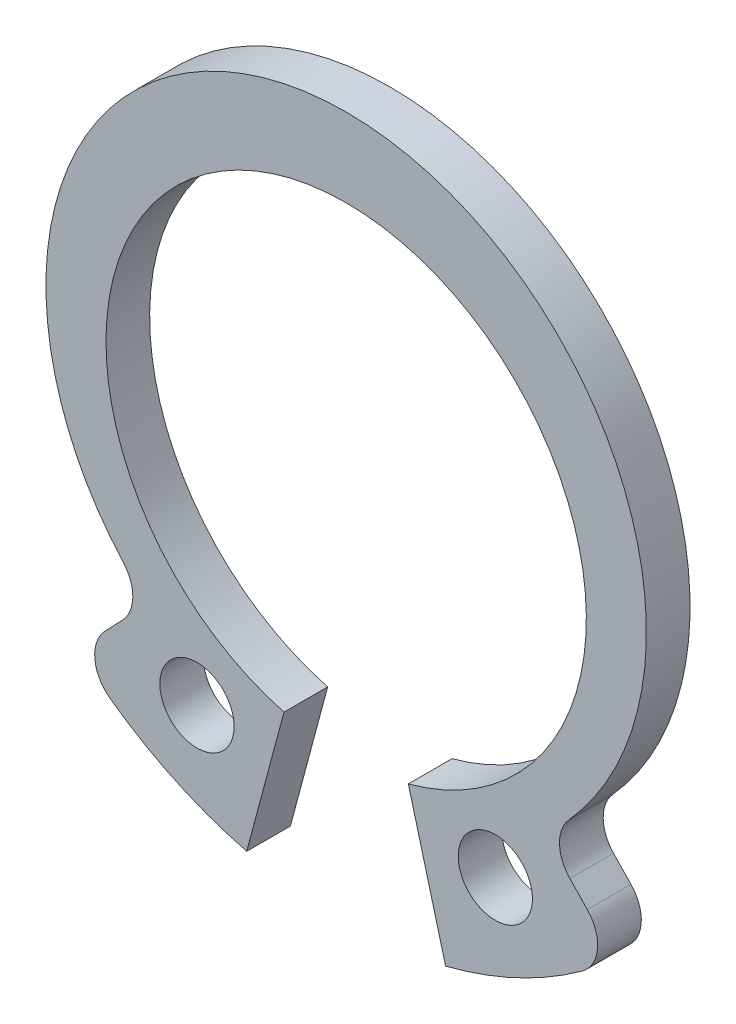
ISO-10303-21;
HEADER;
FILE_DESCRIPTION(('STEP AP214'),'2;1');
FILE_NAME('part.step','',(''),(''),'','','');
FILE_SCHEMA(('AUTOMOTIVE_DESIGN { 1 0 10303 214 1 1 1 1 }'));
ENDSEC;
DATA;
#1=APPLICATION_CONTEXT('core data for automotive mechanical design processes');
#2=APPLICATION_PROTOCOL_DEFINITION('international standard','automotive_design',2000,#1);
#3=PRODUCT_CONTEXT('',#1,'mechanical');
#4=PRODUCT('Part','Part','',(#3));
#5=PRODUCT_RELATED_PRODUCT_CATEGORY('part','',(#4));
#6=PRODUCT_DEFINITION_FORMATION('','',#4);
#7=PRODUCT_DEFINITION_CONTEXT('part definition',#1,'design');
#8=PRODUCT_DEFINITION('design','',#6,#7);
#9=PRODUCT_DEFINITION_SHAPE('','',#8);
#10=(LENGTH_UNIT() NAMED_UNIT(*) SI_UNIT(.MILLI.,.METRE.));
#11=(NAMED_UNIT(*) PLANE_ANGLE_UNIT() SI_UNIT($,.RADIAN.));
#12=(NAMED_UNIT(*) SI_UNIT($,.STERADIAN.) SOLID_ANGLE_UNIT());
#13=UNCERTAINTY_MEASURE_WITH_UNIT(LENGTH_MEASURE(1.E-05),#10,'distance_accuracy_value','');
#14=(GEOMETRIC_REPRESENTATION_CONTEXT(3) GLOBAL_UNCERTAINTY_ASSIGNED_CONTEXT((#13)) GLOBAL_UNIT_ASSIGNED_CONTEXT((#10,
#11,#12)) REPRESENTATION_CONTEXT('',''));
#15=CARTESIAN_POINT('',(0.,0.,0.));
#16=DIRECTION('',(0.,0.,1.));
#17=DIRECTION('',(1.,0.,0.));
#18=AXIS2_PLACEMENT_3D('',#15,#16,#17);
#19=CARTESIAN_POINT('',(-5.73558683385572,-4.74981097928238,0.999999999999931));
#20=DIRECTION('',(0.,0.,-1.));
#21=DIRECTION('',(-1.,0.,0.));
#22=AXIS2_PLACEMENT_3D('',#19,#20,#21);
#23=PLANE('',#22);
#24=CARTESIAN_POINT('',(3.41566292197736,-6.17210734162842,1.));
#25=DIRECTION('',(0.,0.,1.));
#26=DIRECTION('',(1.,0.,0.));
#27=AXIS2_PLACEMENT_3D('',#24,#25,#26);
#28=CIRCLE('',#27,0.85);
#29=CARTESIAN_POINT('',(4.26566292197736,-6.17210734162842,1.));
#30=VERTEX_POINT('',#29);
#31=EDGE_CURVE('E139',#30,#30,#28,.T.);
#32=ORIENTED_EDGE('',*,*,#31,.F.);
#33=EDGE_LOOP('',(#32));
#34=FACE_BOUND('',#33,.T.);
#35=CARTESIAN_POINT('',(-5.73558683385572,-4.74981097928238,0.999999999999931));
#36=DIRECTION('',(0.,0.,-1.));
#37=DIRECTION('',(-1.,0.,0.));
#38=AXIS2_PLACEMENT_3D('',#35,#36,#37);
#39=CIRCLE('',#38,0.85);
#40=CARTESIAN_POINT('',(-5.10448666443473,-4.18041430195035,1.));
#41=VERTEX_POINT('',#40);
#42=CARTESIAN_POINT('',(-5.12226316732908,-5.33831253414727,1.00000000000007));
#43=VERTEX_POINT('',#42);
#44=EDGE_CURVE('E165',#41,#43,#39,.T.);
#45=ORIENTED_EDGE('',*,*,#44,.T.);
#46=DIRECTION('',(-0.692354770429322,-0.721557254737117,0.));
#47=VECTOR('',#46,1.);
#48=CARTESIAN_POINT('',(-5.12226316732908,-5.33831253414727,1.00000000000007));
#49=LINE('',#48,#47);
#50=CARTESIAN_POINT('',(-5.52211529137403,-5.75502982021116,1.00000000000007));
#51=VERTEX_POINT('',#50);
#52=EDGE_CURVE('E134',#43,#51,#49,.T.);
#53=ORIENTED_EDGE('',*,*,#52,.T.);
#54=CARTESIAN_POINT('',(-4.90879162484746,-6.34353137507605,1.00000000000007));
#55=DIRECTION('',(0.,0.,1.));
#56=DIRECTION('',(-1.,0.,0.));
#57=AXIS2_PLACEMENT_3D('',#54,#55,#56);
#58=CIRCLE('',#57,0.850000000000018);
#59=CARTESIAN_POINT('',(-5.40782109589095,-7.03162263866691,1.00000000000006));
#60=VERTEX_POINT('',#59);
#61=EDGE_CURVE('E168',#51,#60,#58,.T.);
#62=ORIENTED_EDGE('',*,*,#61,.T.);
#63=CARTESIAN_POINT('',(0.,0.424999999999995,0.999999999999931));
#64=DIRECTION('',(0.,0.,1.));
#65=DIRECTION('',(1.,0.,0.));
#66=AXIS2_PLACEMENT_3D('',#63,#64,#65);
#67=CIRCLE('',#66,9.21117528769495);
#68=CARTESIAN_POINT('',(-2.27760759690226,-8.50014727134382,0.999999999999931));
#69=VERTEX_POINT('',#68);
#70=EDGE_CURVE('E170',#60,#69,#67,.T.);
#71=ORIENTED_EDGE('',*,*,#70,.T.);
#72=DIRECTION('',(0.258819045102522,0.96592582628907,0.));
#73=VECTOR('',#72,1.);
#74=CARTESIAN_POINT('',(-1.42350474806392,-5.31259204458991,1.));
#75=LINE('',#74,#73);
#76=CARTESIAN_POINT('',(-1.42350474806387,-5.31259204458988,1.));
#77=VERTEX_POINT('',#76);
#78=EDGE_CURVE('E172',#69,#77,#75,.T.);
#79=ORIENTED_EDGE('',*,*,#78,.T.);
#80=CARTESIAN_POINT('',(0.,0.,1.));
#81=DIRECTION('',(0.,0.,-1.));
#82=DIRECTION('',(1.,0.,0.));
#83=AXIS2_PLACEMENT_3D('',#80,#81,#82);
#84=CIRCLE('',#83,5.5);
#85=CARTESIAN_POINT('',(1.42350474806382,-5.31259204458989,1.00000000000007));
#86=VERTEX_POINT('',#85);
#87=EDGE_CURVE('E174',#77,#86,#84,.T.);
#88=ORIENTED_EDGE('',*,*,#87,.T.);
#89=DIRECTION('',(0.258819045102521,-0.96592582628907,0.));
#90=VECTOR('',#89,1.);
#91=CARTESIAN_POINT('',(1.42350474806382,-5.31259204458989,1.00000000000007));
#92=LINE('',#91,#90);
#93=CARTESIAN_POINT('',(2.27760759690215,-8.50014727134382,0.999999999999931));
#94=VERTEX_POINT('',#93);
#95=EDGE_CURVE('E176',#86,#94,#92,.T.);
#96=ORIENTED_EDGE('',*,*,#95,.T.);
#97=CARTESIAN_POINT('',(0.,0.424999999999995,0.999999999999931));
#98=DIRECTION('',(0.,0.,1.));
#99=DIRECTION('',(1.,0.,0.));
#100=AXIS2_PLACEMENT_3D('',#97,#98,#99);
#101=CIRCLE('',#100,9.21117528769495);
#102=CARTESIAN_POINT('',(5.40782109589089,-7.03162263866691,0.999999999999987));
#103=VERTEX_POINT('',#102);
#104=EDGE_CURVE('E178',#94,#103,#101,.T.);
#105=ORIENTED_EDGE('',*,*,#104,.T.);
#106=CARTESIAN_POINT('',(4.90879162484741,-6.34353137507604,1.));
#107=DIRECTION('',(0.,0.,1.));
#108=DIRECTION('',(1.,0.,0.));
#109=AXIS2_PLACEMENT_3D('',#106,#107,#108);
#110=CIRCLE('',#109,0.850000000000017);
#111=CARTESIAN_POINT('',(5.52211529137403,-5.75502982021115,1.));
#112=VERTEX_POINT('',#111);
#113=EDGE_CURVE('E180',#103,#112,#110,.T.);
#114=ORIENTED_EDGE('',*,*,#113,.T.);
#115=DIRECTION('',(-0.692354770429321,0.721557254737118,0.));
#116=VECTOR('',#115,1.);
#117=CARTESIAN_POINT('',(5.12226316732907,-5.33831253414727,1.));
#118=LINE('',#117,#116);
#119=CARTESIAN_POINT('',(5.12226316732907,-5.33831253414727,1.));
#120=VERTEX_POINT('',#119);
#121=EDGE_CURVE('E182',#112,#120,#118,.T.);
#122=ORIENTED_EDGE('',*,*,#121,.T.);
#123=CARTESIAN_POINT('',(5.73558683385563,-4.7498109792824,1.));
#124=DIRECTION('',(0.,0.,-1.));
#125=DIRECTION('',(1.,0.,0.));
#126=AXIS2_PLACEMENT_3D('',#123,#124,#125);
#127=CIRCLE('',#126,0.85);
#128=CARTESIAN_POINT('',(5.10448666443464,-4.18041430195035,1.));
#129=VERTEX_POINT('',#128);
#130=EDGE_CURVE('E51',#120,#129,#127,.T.);
#131=ORIENTED_EDGE('',*,*,#130,.T.);
#132=CARTESIAN_POINT('',(0.,0.424999999999995,0.999999999999931));
#133=DIRECTION('',(0.,0.,1.));
#134=DIRECTION('',(1.,0.,0.));
#135=AXIS2_PLACEMENT_3D('',#132,#133,#134);
#136=CIRCLE('',#135,6.875);
#137=EDGE_CURVE('E46',#129,#41,#136,.T.);
#138=ORIENTED_EDGE('',*,*,#137,.T.);
#139=EDGE_LOOP('',(#45,#53,#62,#71,#79,#88,#96,#105,#114,#122,#131,#138));
#140=FACE_BOUND('',#139,.T.);
#141=CARTESIAN_POINT('',(-3.41566292197739,-6.17210734162839,0.999999999999931));
#142=DIRECTION('',(0.,0.,1.));
#143=DIRECTION('',(-1.,0.,0.));
#144=AXIS2_PLACEMENT_3D('',#141,#142,#143);
#145=CIRCLE('',#144,0.85);
#146=CARTESIAN_POINT('',(-4.26566292197739,-6.17210734162839,0.999999999999931));
#147=VERTEX_POINT('',#146);
#148=EDGE_CURVE('E285',#147,#147,#145,.T.);
#149=ORIENTED_EDGE('',*,*,#148,.F.);
#150=EDGE_LOOP('',(#149));
#151=FACE_BOUND('',#150,.T.);
#152=ADVANCED_FACE('F31',(#34,#140,#151),#23,.F.);
#153=CARTESIAN_POINT('',(-5.73558683385568,-4.74981097928238,0.));
#154=DIRECTION('',(0.,0.,-1.));
#155=DIRECTION('',(-1.,0.,0.));
#156=AXIS2_PLACEMENT_3D('',#153,#154,#155);
#157=PLANE('',#156);
#158=CARTESIAN_POINT('',(3.41566292197737,-6.17210734162838,0.));
#159=DIRECTION('',(0.,0.,1.));
#160=DIRECTION('',(1.,0.,0.));
#161=AXIS2_PLACEMENT_3D('',#158,#159,#160);
#162=CIRCLE('',#161,0.85);
#163=CARTESIAN_POINT('',(4.26566292197737,-6.17210734162838,0.));
#164=VERTEX_POINT('',#163);
#165=EDGE_CURVE('E142',#164,#164,#162,.T.);
#166=ORIENTED_EDGE('',*,*,#165,.T.);
#167=EDGE_LOOP('',(#166));
#168=FACE_BOUND('',#167,.T.);
#169=CARTESIAN_POINT('',(-5.73558683385568,-4.74981097928238,0.));
#170=DIRECTION('',(0.,0.,-1.));
#171=DIRECTION('',(-1.,0.,0.));
#172=AXIS2_PLACEMENT_3D('',#169,#170,#171);
#173=CIRCLE('',#172,0.85);
#174=CARTESIAN_POINT('',(-5.10448666443472,-4.18041430195033,0.));
#175=VERTEX_POINT('',#174);
#176=CARTESIAN_POINT('',(-5.12226316732913,-5.33831253414728,0.));
#177=VERTEX_POINT('',#176);
#178=EDGE_CURVE('E125',#175,#177,#173,.T.);
#179=ORIENTED_EDGE('',*,*,#178,.F.);
#180=CARTESIAN_POINT('',(0.,0.425000000000036,0.));
#181=DIRECTION('',(0.,0.,1.));
#182=DIRECTION('',(1.,0.,0.));
#183=AXIS2_PLACEMENT_3D('',#180,#181,#182);
#184=CIRCLE('',#183,6.875);
#185=CARTESIAN_POINT('',(5.10448666443465,-4.18041430195034,0.));
#186=VERTEX_POINT('',#185);
#187=EDGE_CURVE('E163',#186,#175,#184,.T.);
#188=ORIENTED_EDGE('',*,*,#187,.F.);
#189=CARTESIAN_POINT('',(5.73558683385561,-4.74981097928237,0.));
#190=DIRECTION('',(0.,0.,-1.));
#191=DIRECTION('',(1.,0.,0.));
#192=AXIS2_PLACEMENT_3D('',#189,#190,#191);
#193=CIRCLE('',#192,0.85);
#194=CARTESIAN_POINT('',(5.12226316732907,-5.33831253414727,0.));
#195=VERTEX_POINT('',#194);
#196=EDGE_CURVE('E161',#195,#186,#193,.T.);
#197=ORIENTED_EDGE('',*,*,#196,.F.);
#198=DIRECTION('',(-0.692354770429321,0.721557254737118,0.));
#199=VECTOR('',#198,1.);
#200=CARTESIAN_POINT('',(5.12226316732907,-5.33831253414727,0.));
#201=LINE('',#200,#199);
#202=CARTESIAN_POINT('',(5.52211529137403,-5.75502982021114,0.));
#203=VERTEX_POINT('',#202);
#204=EDGE_CURVE('E159',#203,#195,#201,.T.);
#205=ORIENTED_EDGE('',*,*,#204,.F.);
#206=CARTESIAN_POINT('',(4.90879162484741,-6.34353137507604,0.));
#207=DIRECTION('',(0.,0.,1.));
#208=DIRECTION('',(1.,0.,0.));
#209=AXIS2_PLACEMENT_3D('',#206,#207,#208);
#210=CIRCLE('',#209,0.850000000000017);
#211=CARTESIAN_POINT('',(5.40782109589089,-7.03162263866692,0.));
#212=VERTEX_POINT('',#211);
#213=EDGE_CURVE('E157',#212,#203,#210,.T.);
#214=ORIENTED_EDGE('',*,*,#213,.F.);
#215=CARTESIAN_POINT('',(0.,0.425000000000036,0.));
#216=DIRECTION('',(0.,0.,1.));
#217=DIRECTION('',(1.,0.,0.));
#218=AXIS2_PLACEMENT_3D('',#215,#216,#217);
#219=CIRCLE('',#218,9.21117528769495);
#220=CARTESIAN_POINT('',(2.27760759690214,-8.50014727134379,0.));
#221=VERTEX_POINT('',#220);
#222=EDGE_CURVE('E155',#221,#212,#219,.T.);
#223=ORIENTED_EDGE('',*,*,#222,.F.);
#224=DIRECTION('',(0.258819045102521,-0.96592582628907,0.));
#225=VECTOR('',#224,1.);
#226=CARTESIAN_POINT('',(1.42350474806383,-5.31259204458988,0.));
#227=LINE('',#226,#225);
#228=CARTESIAN_POINT('',(1.42350474806383,-5.31259204458988,0.));
#229=VERTEX_POINT('',#228);
#230=EDGE_CURVE('E153',#229,#221,#227,.T.);
#231=ORIENTED_EDGE('',*,*,#230,.F.);
#232=CARTESIAN_POINT('',(0.,0.,0.));
#233=DIRECTION('',(0.,0.,-1.));
#234=DIRECTION('',(1.,0.,0.));
#235=AXIS2_PLACEMENT_3D('',#232,#233,#234);
#236=CIRCLE('',#235,5.5);
#237=CARTESIAN_POINT('',(-1.42350474806387,-5.31259204458988,0.));
#238=VERTEX_POINT('',#237);
#239=EDGE_CURVE('E151',#238,#229,#236,.T.);
#240=ORIENTED_EDGE('',*,*,#239,.F.);
#241=DIRECTION('',(0.258819045102522,0.96592582628907,0.));
#242=VECTOR('',#241,1.);
#243=CARTESIAN_POINT('',(-1.42350474806395,-5.31259204458989,0.));
#244=LINE('',#243,#242);
#245=CARTESIAN_POINT('',(-2.2776075969022,-8.5001472713438,0.));
#246=VERTEX_POINT('',#245);
#247=EDGE_CURVE('E149',#246,#238,#244,.T.);
#248=ORIENTED_EDGE('',*,*,#247,.F.);
#249=CARTESIAN_POINT('',(0.,0.425000000000036,0.));
#250=DIRECTION('',(0.,0.,1.));
#251=DIRECTION('',(1.,0.,0.));
#252=AXIS2_PLACEMENT_3D('',#249,#250,#251);
#253=CIRCLE('',#252,9.21117528769495);
#254=CARTESIAN_POINT('',(-5.40782109589091,-7.03162263866688,0.));
#255=VERTEX_POINT('',#254);
#256=EDGE_CURVE('E147',#255,#246,#253,.T.);
#257=ORIENTED_EDGE('',*,*,#256,.F.);
#258=CARTESIAN_POINT('',(-4.90879162484745,-6.34353137507602,0.));
#259=DIRECTION('',(0.,0.,1.));
#260=DIRECTION('',(-1.,0.,0.));
#261=AXIS2_PLACEMENT_3D('',#258,#259,#260);
#262=CIRCLE('',#261,0.850000000000018);
#263=CARTESIAN_POINT('',(-5.52211529137409,-5.75502982021114,0.));
#264=VERTEX_POINT('',#263);
#265=EDGE_CURVE('E127',#264,#255,#262,.T.);
#266=ORIENTED_EDGE('',*,*,#265,.F.);
#267=DIRECTION('',(-0.692354770429322,-0.721557254737117,0.));
#268=VECTOR('',#267,1.);
#269=CARTESIAN_POINT('',(-5.12226316732913,-5.33831253414728,0.));
#270=LINE('',#269,#268);
#271=EDGE_CURVE('E120',#177,#264,#270,.T.);
#272=ORIENTED_EDGE('',*,*,#271,.F.);
#273=EDGE_LOOP('',(#179,#188,#197,#205,#214,#223,#231,#240,#248,#257,#266,#272));
#274=FACE_BOUND('',#273,.T.);
#275=CARTESIAN_POINT('',(-3.41566292197738,-6.17210734162839,0.));
#276=DIRECTION('',(0.,0.,1.));
#277=DIRECTION('',(-1.,0.,0.));
#278=AXIS2_PLACEMENT_3D('',#275,#276,#277);
#279=CIRCLE('',#278,0.85);
#280=CARTESIAN_POINT('',(-4.26566292197738,-6.17210734162839,0.));
#281=VERTEX_POINT('',#280);
#282=EDGE_CURVE('E288',#281,#281,#279,.T.);
#283=ORIENTED_EDGE('',*,*,#282,.T.);
#284=EDGE_LOOP('',(#283));
#285=FACE_BOUND('',#284,.T.);
#286=ADVANCED_FACE('F121',(#168,#274,#285),#157,.T.);
#287=CARTESIAN_POINT('',(-5.73558683385572,-4.74981097928238,0.999999999999931));
#288=DIRECTION('',(0.,0.,-1.));
#289=DIRECTION('',(-1.,0.,0.));
#290=AXIS2_PLACEMENT_3D('',#287,#288,#289);
#291=CYLINDRICAL_SURFACE('',#290,0.85);
#292=ORIENTED_EDGE('',*,*,#178,.T.);
#293=DIRECTION('',(0.,0.,-1.));
#294=VECTOR('',#293,1.);
#295=CARTESIAN_POINT('',(-5.12226316732908,-5.33831253414727,1.00000000000007));
#296=LINE('',#295,#294);
#297=EDGE_CURVE('E11',#43,#177,#296,.T.);
#298=ORIENTED_EDGE('',*,*,#297,.F.);
#299=ORIENTED_EDGE('',*,*,#44,.F.);
#300=DIRECTION('',(0.,0.,-1.));
#301=VECTOR('',#300,1.);
#302=CARTESIAN_POINT('',(-5.10448666443473,-4.18041430195035,1.));
#303=LINE('',#302,#301);
#304=EDGE_CURVE('E138',#41,#175,#303,.T.);
#305=ORIENTED_EDGE('',*,*,#304,.T.);
#306=EDGE_LOOP('',(#292,#298,#299,#305));
#307=FACE_BOUND('',#306,.T.);
#308=ADVANCED_FACE('F33',(#307),#291,.F.);
#309=CARTESIAN_POINT('',(-5.12226316732908,-5.33831253414727,1.00000000000007));
#310=DIRECTION('',(0.721557254737117,-0.692354770429322,0.));
#311=DIRECTION('',(0.692354770429322,0.721557254737117,0.));
#312=AXIS2_PLACEMENT_3D('',#309,#310,#311);
#313=PLANE('',#312);
#314=ORIENTED_EDGE('',*,*,#271,.T.);
#315=DIRECTION('',(0.,0.,-1.));
#316=VECTOR('',#315,1.);
#317=CARTESIAN_POINT('',(-5.52211529137403,-5.75502982021116,1.00000000000007));
#318=LINE('',#317,#316);
#319=EDGE_CURVE('E39',#51,#264,#318,.T.);
#320=ORIENTED_EDGE('',*,*,#319,.F.);
#321=ORIENTED_EDGE('',*,*,#52,.F.);
#322=ORIENTED_EDGE('',*,*,#297,.T.);
#323=EDGE_LOOP('',(#314,#320,#321,#322));
#324=FACE_BOUND('',#323,.T.);
#325=ADVANCED_FACE('F133',(#324),#313,.F.);
#326=CARTESIAN_POINT('',(-4.90879162484746,-6.34353137507605,1.00000000000007));
#327=DIRECTION('',(0.,0.,-1.));
#328=DIRECTION('',(-1.,0.,0.));
#329=AXIS2_PLACEMENT_3D('',#326,#327,#328);
#330=CYLINDRICAL_SURFACE('',#329,0.850000000000018);
#331=ORIENTED_EDGE('',*,*,#265,.T.);
#332=DIRECTION('',(0.,0.,-1.));
#333=VECTOR('',#332,1.);
#334=CARTESIAN_POINT('',(-5.40782109589095,-7.03162263866691,1.00000000000006));
#335=LINE('',#334,#333);
#336=EDGE_CURVE('E211',#60,#255,#335,.T.);
#337=ORIENTED_EDGE('',*,*,#336,.F.);
#338=ORIENTED_EDGE('',*,*,#61,.F.);
#339=ORIENTED_EDGE('',*,*,#319,.T.);
#340=EDGE_LOOP('',(#331,#337,#338,#339));
#341=FACE_BOUND('',#340,.T.);
#342=ADVANCED_FACE('F215',(#341),#330,.T.);
#343=CARTESIAN_POINT('',(0.,0.424999999999995,0.999999999999931));
#344=DIRECTION('',(0.,0.,-1.));
#345=DIRECTION('',(-1.,0.,0.));
#346=AXIS2_PLACEMENT_3D('',#343,#344,#345);
#347=CYLINDRICAL_SURFACE('',#346,9.21117528769495);
#348=ORIENTED_EDGE('',*,*,#256,.T.);
#349=DIRECTION('',(0.,0.,-1.));
#350=VECTOR('',#349,1.);
#351=CARTESIAN_POINT('',(-2.27760759690226,-8.50014727134382,0.999999999999931));
#352=LINE('',#351,#350);
#353=EDGE_CURVE('E208',#69,#246,#352,.T.);
#354=ORIENTED_EDGE('',*,*,#353,.F.);
#355=ORIENTED_EDGE('',*,*,#70,.F.);
#356=ORIENTED_EDGE('',*,*,#336,.T.);
#357=EDGE_LOOP('',(#348,#354,#355,#356));
#358=FACE_BOUND('',#357,.T.);
#359=ADVANCED_FACE('F223',(#358),#347,.T.);
#360=CARTESIAN_POINT('',(-1.42350474806392,-5.31259204458991,1.));
#361=DIRECTION('',(-0.96592582628907,0.258819045102522,0.));
#362=DIRECTION('',(-0.258819045102522,-0.96592582628907,0.));
#363=AXIS2_PLACEMENT_3D('',#360,#361,#362);
#364=PLANE('',#363);
#365=ORIENTED_EDGE('',*,*,#247,.T.);
#366=DIRECTION('',(0.,0.,-1.));
#367=VECTOR('',#366,1.);
#368=CARTESIAN_POINT('',(-1.42350474806387,-5.31259204458988,1.));
#369=LINE('',#368,#367);
#370=EDGE_CURVE('E205',#77,#238,#369,.T.);
#371=ORIENTED_EDGE('',*,*,#370,.F.);
#372=ORIENTED_EDGE('',*,*,#78,.F.);
#373=ORIENTED_EDGE('',*,*,#353,.T.);
#374=EDGE_LOOP('',(#365,#371,#372,#373));
#375=FACE_BOUND('',#374,.T.);
#376=ADVANCED_FACE('F226',(#375),#364,.F.);
#377=CARTESIAN_POINT('',(0.,0.,1.));
#378=DIRECTION('',(0.,0.,-1.));
#379=DIRECTION('',(-1.,0.,0.));
#380=AXIS2_PLACEMENT_3D('',#377,#378,#379);
#381=CYLINDRICAL_SURFACE('',#380,5.5);
#382=ORIENTED_EDGE('',*,*,#239,.T.);
#383=DIRECTION('',(0.,0.,-1.));
#384=VECTOR('',#383,1.);
#385=CARTESIAN_POINT('',(1.42350474806382,-5.31259204458989,1.00000000000007));
#386=LINE('',#385,#384);
#387=EDGE_CURVE('E202',#86,#229,#386,.T.);
#388=ORIENTED_EDGE('',*,*,#387,.F.);
#389=ORIENTED_EDGE('',*,*,#87,.F.);
#390=ORIENTED_EDGE('',*,*,#370,.T.);
#391=EDGE_LOOP('',(#382,#388,#389,#390));
#392=FACE_BOUND('',#391,.T.);
#393=ADVANCED_FACE('F231',(#392),#381,.F.);
#394=CARTESIAN_POINT('',(1.42350474806382,-5.31259204458989,1.00000000000007));
#395=DIRECTION('',(0.965925826289071,0.258819045102521,0.));
#396=DIRECTION('',(-0.258819045102521,0.965925826289071,0.));
#397=AXIS2_PLACEMENT_3D('',#394,#395,#396);
#398=PLANE('',#397);
#399=ORIENTED_EDGE('',*,*,#230,.T.);
#400=DIRECTION('',(0.,0.,-1.));
#401=VECTOR('',#400,1.);
#402=CARTESIAN_POINT('',(2.27760759690215,-8.50014727134382,0.999999999999931));
#403=LINE('',#402,#401);
#404=EDGE_CURVE('E199',#94,#221,#403,.T.);
#405=ORIENTED_EDGE('',*,*,#404,.F.);
#406=ORIENTED_EDGE('',*,*,#95,.F.);
#407=ORIENTED_EDGE('',*,*,#387,.T.);
#408=EDGE_LOOP('',(#399,#405,#406,#407));
#409=FACE_BOUND('',#408,.T.);
#410=ADVANCED_FACE('F237',(#409),#398,.F.);
#411=CARTESIAN_POINT('',(0.,0.424999999999995,0.999999999999931));
#412=DIRECTION('',(0.,0.,-1.));
#413=DIRECTION('',(-1.,0.,0.));
#414=AXIS2_PLACEMENT_3D('',#411,#412,#413);
#415=CYLINDRICAL_SURFACE('',#414,9.21117528769495);
#416=ORIENTED_EDGE('',*,*,#222,.T.);
#417=DIRECTION('',(0.,0.,-1.));
#418=VECTOR('',#417,1.);
#419=CARTESIAN_POINT('',(5.40782109589089,-7.03162263866691,0.999999999999987));
#420=LINE('',#419,#418);
#421=EDGE_CURVE('E196',#103,#212,#420,.T.);
#422=ORIENTED_EDGE('',*,*,#421,.F.);
#423=ORIENTED_EDGE('',*,*,#104,.F.);
#424=ORIENTED_EDGE('',*,*,#404,.T.);
#425=EDGE_LOOP('',(#416,#422,#423,#424));
#426=FACE_BOUND('',#425,.T.);
#427=ADVANCED_FACE('F241',(#426),#415,.T.);
#428=CARTESIAN_POINT('',(4.90879162484741,-6.34353137507604,1.));
#429=DIRECTION('',(0.,0.,-1.));
#430=DIRECTION('',(-1.,0.,0.));
#431=AXIS2_PLACEMENT_3D('',#428,#429,#430);
#432=CYLINDRICAL_SURFACE('',#431,0.850000000000017);
#433=ORIENTED_EDGE('',*,*,#213,.T.);
#434=DIRECTION('',(0.,0.,-1.));
#435=VECTOR('',#434,1.);
#436=CARTESIAN_POINT('',(5.52211529137403,-5.75502982021115,1.));
#437=LINE('',#436,#435);
#438=EDGE_CURVE('E193',#112,#203,#437,.T.);
#439=ORIENTED_EDGE('',*,*,#438,.F.);
#440=ORIENTED_EDGE('',*,*,#113,.F.);
#441=ORIENTED_EDGE('',*,*,#421,.T.);
#442=EDGE_LOOP('',(#433,#439,#440,#441));
#443=FACE_BOUND('',#442,.T.);
#444=ADVANCED_FACE('F246',(#443),#432,.T.);
#445=CARTESIAN_POINT('',(5.12226316732907,-5.33831253414727,1.));
#446=DIRECTION('',(-0.721557254737118,-0.692354770429321,0.));
#447=DIRECTION('',(0.692354770429321,-0.721557254737118,0.));
#448=AXIS2_PLACEMENT_3D('',#445,#446,#447);
#449=PLANE('',#448);
#450=ORIENTED_EDGE('',*,*,#204,.T.);
#451=DIRECTION('',(0.,0.,-1.));
#452=VECTOR('',#451,1.);
#453=CARTESIAN_POINT('',(5.12226316732907,-5.33831253414727,1.));
#454=LINE('',#453,#452);
#455=EDGE_CURVE('E190',#120,#195,#454,.T.);
#456=ORIENTED_EDGE('',*,*,#455,.F.);
#457=ORIENTED_EDGE('',*,*,#121,.F.);
#458=ORIENTED_EDGE('',*,*,#438,.T.);
#459=EDGE_LOOP('',(#450,#456,#457,#458));
#460=FACE_BOUND('',#459,.T.);
#461=ADVANCED_FACE('F250',(#460),#449,.F.);
#462=CARTESIAN_POINT('',(5.73558683385563,-4.7498109792824,1.));
#463=DIRECTION('',(0.,0.,-1.));
#464=DIRECTION('',(-1.,0.,0.));
#465=AXIS2_PLACEMENT_3D('',#462,#463,#464);
#466=CYLINDRICAL_SURFACE('',#465,0.85);
#467=ORIENTED_EDGE('',*,*,#196,.T.);
#468=DIRECTION('',(0.,0.,-1.));
#469=VECTOR('',#468,1.);
#470=CARTESIAN_POINT('',(5.10448666443464,-4.18041430195035,1.));
#471=LINE('',#470,#469);
#472=EDGE_CURVE('E187',#129,#186,#471,.T.);
#473=ORIENTED_EDGE('',*,*,#472,.F.);
#474=ORIENTED_EDGE('',*,*,#130,.F.);
#475=ORIENTED_EDGE('',*,*,#455,.T.);
#476=EDGE_LOOP('',(#467,#473,#474,#475));
#477=FACE_BOUND('',#476,.T.);
#478=ADVANCED_FACE('F254',(#477),#466,.F.);
#479=CARTESIAN_POINT('',(0.,0.424999999999995,0.999999999999931));
#480=DIRECTION('',(0.,0.,-1.));
#481=DIRECTION('',(-1.,0.,0.));
#482=AXIS2_PLACEMENT_3D('',#479,#480,#481);
#483=CYLINDRICAL_SURFACE('',#482,6.875);
#484=ORIENTED_EDGE('',*,*,#187,.T.);
#485=ORIENTED_EDGE('',*,*,#304,.F.);
#486=ORIENTED_EDGE('',*,*,#137,.F.);
#487=ORIENTED_EDGE('',*,*,#472,.T.);
#488=EDGE_LOOP('',(#484,#485,#486,#487));
#489=FACE_BOUND('',#488,.T.);
#490=ADVANCED_FACE('F256',(#489),#483,.T.);
#491=CARTESIAN_POINT('',(3.41566292197736,-6.17210734162842,1.));
#492=DIRECTION('',(0.,0.,-1.));
#493=DIRECTION('',(-1.,0.,0.));
#494=AXIS2_PLACEMENT_3D('',#491,#492,#493);
#495=CYLINDRICAL_SURFACE('',#494,0.85);
#496=ORIENTED_EDGE('',*,*,#31,.T.);
#497=EDGE_LOOP('',(#496));
#498=FACE_BOUND('',#497,.T.);
#499=ORIENTED_EDGE('',*,*,#165,.F.);
#500=EDGE_LOOP('',(#499));
#501=FACE_BOUND('',#500,.T.);
#502=ADVANCED_FACE('F258',(#498,#501),#495,.F.);
#503=CARTESIAN_POINT('',(-3.41566292197739,-6.17210734162839,0.999999999999931));
#504=DIRECTION('',(0.,0.,-1.));
#505=DIRECTION('',(-1.,0.,0.));
#506=AXIS2_PLACEMENT_3D('',#503,#504,#505);
#507=CYLINDRICAL_SURFACE('',#506,0.85);
#508=ORIENTED_EDGE('',*,*,#148,.T.);
#509=EDGE_LOOP('',(#508));
#510=FACE_BOUND('',#509,.T.);
#511=ORIENTED_EDGE('',*,*,#282,.F.);
#512=EDGE_LOOP('',(#511));
#513=FACE_BOUND('',#512,.T.);
#514=ADVANCED_FACE('F264',(#510,#513),#507,.F.);
#515=CLOSED_SHELL('',(#152,#286,#308,#325,#342,#359,#376,#393,#410,#427,#444,#461,#478,#490,
#502,#514));
#516=MANIFOLD_SOLID_BREP('B2',#515);
#517=ADVANCED_BREP_SHAPE_REPRESENTATION('',(#18,#516),#14);
#518=SHAPE_DEFINITION_REPRESENTATION(#9,#517);
ENDSEC;
END-ISO-10303-21;
